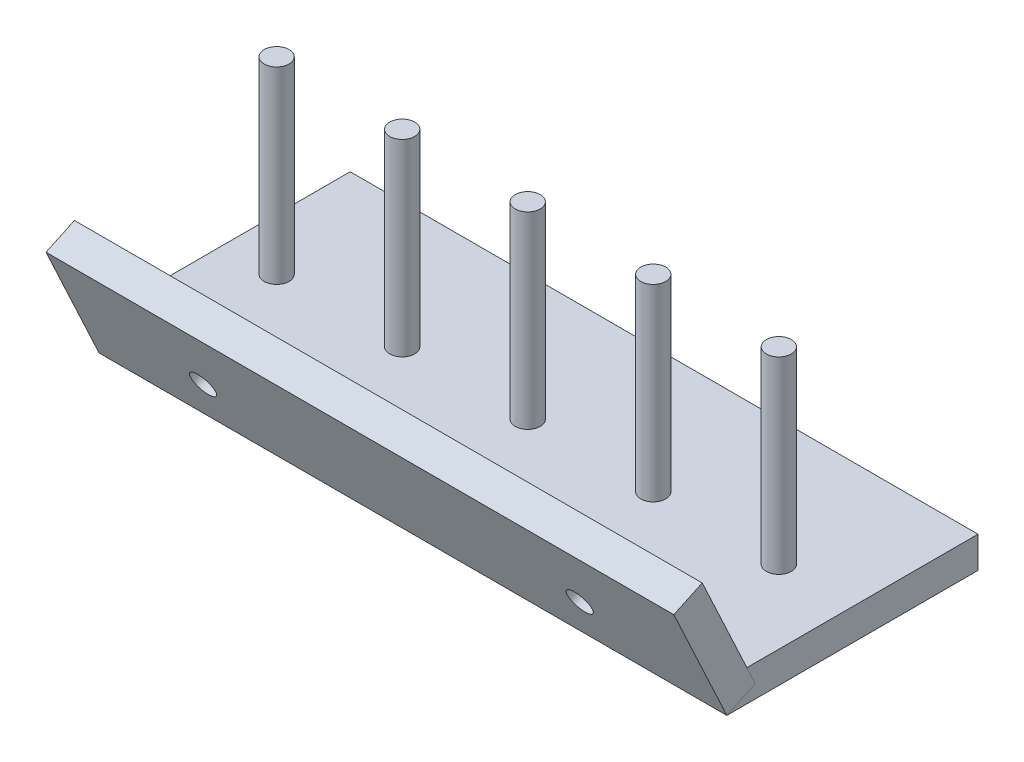
ISO-10303-21;
HEADER;
FILE_DESCRIPTION(('STEP AP214'),'2;1');
FILE_NAME('part.step','',(''),(''),'','','');
FILE_SCHEMA(('AUTOMOTIVE_DESIGN { 1 0 10303 214 1 1 1 1 }'));
ENDSEC;
DATA;
#1=APPLICATION_CONTEXT('core data for automotive mechanical design processes');
#2=APPLICATION_PROTOCOL_DEFINITION('international standard','automotive_design',2000,#1);
#3=PRODUCT_CONTEXT('',#1,'mechanical');
#4=PRODUCT('Part','Part','',(#3));
#5=PRODUCT_RELATED_PRODUCT_CATEGORY('part','',(#4));
#6=PRODUCT_DEFINITION_FORMATION('','',#4);
#7=PRODUCT_DEFINITION_CONTEXT('part definition',#1,'design');
#8=PRODUCT_DEFINITION('design','',#6,#7);
#9=PRODUCT_DEFINITION_SHAPE('','',#8);
#10=(LENGTH_UNIT() NAMED_UNIT(*) SI_UNIT(.MILLI.,.METRE.));
#11=(NAMED_UNIT(*) PLANE_ANGLE_UNIT() SI_UNIT($,.RADIAN.));
#12=(NAMED_UNIT(*) SI_UNIT($,.STERADIAN.) SOLID_ANGLE_UNIT());
#13=UNCERTAINTY_MEASURE_WITH_UNIT(LENGTH_MEASURE(1.E-05),#10,'distance_accuracy_value','');
#14=(GEOMETRIC_REPRESENTATION_CONTEXT(3) GLOBAL_UNCERTAINTY_ASSIGNED_CONTEXT((#13)) GLOBAL_UNIT_ASSIGNED_CONTEXT((#10,
#11,#12)) REPRESENTATION_CONTEXT('',''));
#15=CARTESIAN_POINT('',(0.,0.,0.));
#16=DIRECTION('',(0.,0.,1.));
#17=DIRECTION('',(1.,0.,0.));
#18=AXIS2_PLACEMENT_3D('',#15,#16,#17);
#19=CARTESIAN_POINT('',(30.,11.606943430307,14.3786274196991));
#20=DIRECTION('',(0.,-0.422618261740703,0.906307787036648));
#21=DIRECTION('',(0.,-0.906307787036648,-0.422618261740703));
#22=AXIS2_PLACEMENT_3D('',#19,#20,#21);
#23=CYLINDRICAL_SURFACE('',#22,2.00000000000001);
#24=CARTESIAN_POINT('',(30.,7.38076081289992,23.4417052900656));
#25=DIRECTION('',(0.,-0.422618261740703,0.906307787036648));
#26=DIRECTION('',(0.,-0.906307787036648,-0.422618261740703));
#27=AXIS2_PLACEMENT_3D('',#24,#25,#26);
#28=CIRCLE('',#27,2.00000000000001);
#29=CARTESIAN_POINT('',(30.,5.56814523882662,22.5964687665842));
#30=VERTEX_POINT('',#29);
#31=EDGE_CURVE('E133',#30,#30,#28,.T.);
#32=ORIENTED_EDGE('',*,*,#31,.T.);
#33=EDGE_LOOP('',(#32));
#34=FACE_BOUND('',#33,.T.);
#35=CARTESIAN_POINT('',(30.,8.64861559812204,20.7227819289556));
#36=DIRECTION('',(0.,0.422618261740703,-0.906307787036648));
#37=DIRECTION('',(0.,0.906307787036648,0.422618261740703));
#38=AXIS2_PLACEMENT_3D('',#35,#36,#37);
#39=CIRCLE('',#38,2.00000000000001);
#40=CARTESIAN_POINT('',(30.,10.4612311721953,21.5680184524371));
#41=VERTEX_POINT('',#40);
#42=EDGE_CURVE('E125',#41,#41,#39,.F.);
#43=ORIENTED_EDGE('',*,*,#42,.F.);
#44=EDGE_LOOP('',(#43));
#45=FACE_BOUND('',#44,.T.);
#46=ADVANCED_FACE('F43',(#34,#45),#23,.F.);
#47=CARTESIAN_POINT('',(-30.,11.606943430307,14.3786274196991));
#48=DIRECTION('',(0.,-0.422618261740703,0.906307787036648));
#49=DIRECTION('',(0.,-0.906307787036648,-0.422618261740703));
#50=AXIS2_PLACEMENT_3D('',#47,#48,#49);
#51=CYLINDRICAL_SURFACE('',#50,2.00000000000001);
#52=CARTESIAN_POINT('',(-30.,7.38076081289992,23.4417052900656));
#53=DIRECTION('',(0.,-0.422618261740703,0.906307787036648));
#54=DIRECTION('',(0.,-0.906307787036648,-0.422618261740703));
#55=AXIS2_PLACEMENT_3D('',#52,#53,#54);
#56=CIRCLE('',#55,2.00000000000001);
#57=CARTESIAN_POINT('',(-30.,5.56814523882662,22.5964687665842));
#58=VERTEX_POINT('',#57);
#59=EDGE_CURVE('E115',#58,#58,#56,.T.);
#60=ORIENTED_EDGE('',*,*,#59,.T.);
#61=EDGE_LOOP('',(#60));
#62=FACE_BOUND('',#61,.T.);
#63=CARTESIAN_POINT('',(-30.,8.64861559812204,20.7227819289556));
#64=DIRECTION('',(0.,0.422618261740703,-0.906307787036648));
#65=DIRECTION('',(0.,0.906307787036648,0.422618261740703));
#66=AXIS2_PLACEMENT_3D('',#63,#64,#65);
#67=CIRCLE('',#66,2.00000000000001);
#68=CARTESIAN_POINT('',(-30.,10.4612311721953,21.5680184524371));
#69=VERTEX_POINT('',#68);
#70=EDGE_CURVE('E122',#69,#69,#67,.F.);
#71=ORIENTED_EDGE('',*,*,#70,.F.);
#72=EDGE_LOOP('',(#71));
#73=FACE_BOUND('',#72,.T.);
#74=ADVANCED_FACE('F162',(#62,#73),#51,.F.);
#75=CARTESIAN_POINT('',(-50.,2.11309130870352,15.4684610648168));
#76=DIRECTION('',(-1.,0.,0.));
#77=DIRECTION('',(0.,0.,1.));
#78=AXIS2_PLACEMENT_3D('',#75,#76,#77);
#79=PLANE('',#78);
#80=DIRECTION('',(0.,-0.906307787036648,-0.422618261740703));
#81=VECTOR('',#80,1.);
#82=CARTESIAN_POINT('',(-50.,0.,20.));
#83=LINE('',#82,#81);
#84=CARTESIAN_POINT('',(-50.,18.126155740733,28.4523652348141));
#85=VERTEX_POINT('',#84);
#86=CARTESIAN_POINT('',(-50.,0.,20.));
#87=VERTEX_POINT('',#86);
#88=EDGE_CURVE('E111',#85,#87,#83,.T.);
#89=ORIENTED_EDGE('',*,*,#88,.F.);
#90=DIRECTION('',(0.,-0.422618261740703,0.906307787036648));
#91=VECTOR('',#90,1.);
#92=CARTESIAN_POINT('',(-50.,20.2392470494365,23.9208262996308));
#93=LINE('',#92,#91);
#94=CARTESIAN_POINT('',(-50.,20.2392470494365,23.9208262996308));
#95=VERTEX_POINT('',#94);
#96=EDGE_CURVE('E12',#95,#85,#93,.T.);
#97=ORIENTED_EDGE('',*,*,#96,.F.);
#98=DIRECTION('',(0.,-0.906307787036648,-0.422618261740703));
#99=VECTOR('',#98,1.);
#100=CARTESIAN_POINT('',(-50.,2.11309130870352,15.4684610648168));
#101=LINE('',#100,#99);
#102=CARTESIAN_POINT('',(-50.,2.11309130870352,15.4684610648168));
#103=VERTEX_POINT('',#102);
#104=EDGE_CURVE('E104',#95,#103,#101,.T.);
#105=ORIENTED_EDGE('',*,*,#104,.T.);
#106=DIRECTION('',(0.,-0.422618261740703,0.906307787036648));
#107=VECTOR('',#106,1.);
#108=CARTESIAN_POINT('',(-50.,2.11309130870352,15.4684610648168));
#109=LINE('',#108,#107);
#110=EDGE_CURVE('E87',#103,#87,#109,.T.);
#111=ORIENTED_EDGE('',*,*,#110,.T.);
#112=EDGE_LOOP('',(#89,#97,#105,#111));
#113=FACE_BOUND('',#112,.T.);
#114=ADVANCED_FACE('F45',(#113),#79,.T.);
#115=CARTESIAN_POINT('',(-50.,20.2392470494365,23.9208262996308));
#116=DIRECTION('',(0.,0.906307787036648,0.422618261740703));
#117=DIRECTION('',(0.,-0.422618261740703,0.906307787036648));
#118=AXIS2_PLACEMENT_3D('',#115,#116,#117);
#119=PLANE('',#118);
#120=DIRECTION('',(-1.,0.,0.));
#121=VECTOR('',#120,1.);
#122=CARTESIAN_POINT('',(-50.,18.126155740733,28.4523652348141));
#123=LINE('',#122,#121);
#124=CARTESIAN_POINT('',(50.,18.126155740733,28.4523652348141));
#125=VERTEX_POINT('',#124);
#126=EDGE_CURVE('E106',#125,#85,#123,.T.);
#127=ORIENTED_EDGE('',*,*,#126,.F.);
#128=DIRECTION('',(0.,-0.422618261740703,0.906307787036648));
#129=VECTOR('',#128,1.);
#130=CARTESIAN_POINT('',(50.,20.2392470494365,23.9208262996308));
#131=LINE('',#130,#129);
#132=CARTESIAN_POINT('',(50.,20.2392470494365,23.9208262996308));
#133=VERTEX_POINT('',#132);
#134=EDGE_CURVE('E53',#133,#125,#131,.T.);
#135=ORIENTED_EDGE('',*,*,#134,.F.);
#136=DIRECTION('',(-1.,0.,0.));
#137=VECTOR('',#136,1.);
#138=CARTESIAN_POINT('',(-50.,20.2392470494365,23.9208262996308));
#139=LINE('',#138,#137);
#140=EDGE_CURVE('E101',#133,#95,#139,.T.);
#141=ORIENTED_EDGE('',*,*,#140,.T.);
#142=ORIENTED_EDGE('',*,*,#96,.T.);
#143=EDGE_LOOP('',(#127,#135,#141,#142));
#144=FACE_BOUND('',#143,.T.);
#145=ADVANCED_FACE('F179',(#144),#119,.T.);
#146=CARTESIAN_POINT('',(50.,2.11309130870352,15.4684610648168));
#147=DIRECTION('',(1.,0.,0.));
#148=DIRECTION('',(0.,0.,-1.));
#149=AXIS2_PLACEMENT_3D('',#146,#147,#148);
#150=PLANE('',#149);
#151=DIRECTION('',(0.,0.906307787036648,0.422618261740703));
#152=VECTOR('',#151,1.);
#153=CARTESIAN_POINT('',(50.,0.,20.));
#154=LINE('',#153,#152);
#155=CARTESIAN_POINT('',(50.,0.,20.));
#156=VERTEX_POINT('',#155);
#157=EDGE_CURVE('E95',#156,#125,#154,.T.);
#158=ORIENTED_EDGE('',*,*,#157,.F.);
#159=DIRECTION('',(0.,-0.422618261740703,0.906307787036648));
#160=VECTOR('',#159,1.);
#161=CARTESIAN_POINT('',(50.,2.11309130870352,15.4684610648168));
#162=LINE('',#161,#160);
#163=CARTESIAN_POINT('',(50.,2.11309130870352,15.4684610648168));
#164=VERTEX_POINT('',#163);
#165=EDGE_CURVE('E90',#164,#156,#162,.T.);
#166=ORIENTED_EDGE('',*,*,#165,.F.);
#167=DIRECTION('',(0.,0.906307787036648,0.422618261740703));
#168=VECTOR('',#167,1.);
#169=CARTESIAN_POINT('',(50.,2.11309130870352,15.4684610648168));
#170=LINE('',#169,#168);
#171=EDGE_CURVE('E93',#164,#133,#170,.T.);
#172=ORIENTED_EDGE('',*,*,#171,.T.);
#173=ORIENTED_EDGE('',*,*,#134,.T.);
#174=EDGE_LOOP('',(#158,#166,#172,#173));
#175=FACE_BOUND('',#174,.T.);
#176=ADVANCED_FACE('F92',(#175),#150,.T.);
#177=CARTESIAN_POINT('',(-50.,2.11309130870352,15.4684610648168));
#178=DIRECTION('',(0.,-0.906307787036648,-0.422618261740703));
#179=DIRECTION('',(0.,0.422618261740703,-0.906307787036648));
#180=AXIS2_PLACEMENT_3D('',#177,#178,#179);
#181=PLANE('',#180);
#182=DIRECTION('',(1.,0.,0.));
#183=VECTOR('',#182,1.);
#184=CARTESIAN_POINT('',(-50.,0.,20.));
#185=LINE('',#184,#183);
#186=EDGE_CURVE('E114',#87,#156,#185,.T.);
#187=ORIENTED_EDGE('',*,*,#186,.F.);
#188=ORIENTED_EDGE('',*,*,#110,.F.);
#189=DIRECTION('',(1.,0.,0.));
#190=VECTOR('',#189,1.);
#191=CARTESIAN_POINT('',(-50.,2.11309130870352,15.4684610648168));
#192=LINE('',#191,#190);
#193=EDGE_CURVE('E100',#103,#164,#192,.T.);
#194=ORIENTED_EDGE('',*,*,#193,.T.);
#195=ORIENTED_EDGE('',*,*,#165,.T.);
#196=EDGE_LOOP('',(#187,#188,#194,#195));
#197=FACE_BOUND('',#196,.T.);
#198=ADVANCED_FACE('F103',(#197),#181,.T.);
#199=CARTESIAN_POINT('',(0.,-5.54735312248632,11.8963371616821));
#200=DIRECTION('',(0.,0.422618261740703,-0.906307787036648));
#201=DIRECTION('',(0.,0.906307787036648,0.422618261740703));
#202=AXIS2_PLACEMENT_3D('',#199,#200,#201);
#203=PLANE('',#202);
#204=CARTESIAN_POINT('',(30.,9.49385212160344,18.9101663548823));
#205=DIRECTION('',(0.,0.422618261740703,-0.906307787036648));
#206=DIRECTION('',(0.,0.906307787036648,0.422618261740703));
#207=AXIS2_PLACEMENT_3D('',#204,#205,#206);
#208=CIRCLE('',#207,2.99559975740138);
#209=CARTESIAN_POINT('',(30.,12.2087875085814,20.1761615172262));
#210=VERTEX_POINT('',#209);
#211=EDGE_CURVE('E47',#210,#210,#208,.F.);
#212=ORIENTED_EDGE('',*,*,#211,.T.);
#213=EDGE_LOOP('',(#212));
#214=FACE_BOUND('',#213,.T.);
#215=CARTESIAN_POINT('',(-30.,9.49385212160344,18.9101663548823));
#216=DIRECTION('',(0.,0.422618261740703,-0.906307787036648));
#217=DIRECTION('',(0.,0.906307787036648,0.422618261740703));
#218=AXIS2_PLACEMENT_3D('',#215,#216,#217);
#219=CIRCLE('',#218,3.);
#220=CARTESIAN_POINT('',(-30.,12.2127754827134,20.1780211401045));
#221=VERTEX_POINT('',#220);
#222=EDGE_CURVE('E128',#221,#221,#219,.F.);
#223=ORIENTED_EDGE('',*,*,#222,.T.);
#224=EDGE_LOOP('',(#223));
#225=FACE_BOUND('',#224,.T.);
#226=ORIENTED_EDGE('',*,*,#104,.F.);
#227=ORIENTED_EDGE('',*,*,#140,.F.);
#228=ORIENTED_EDGE('',*,*,#171,.F.);
#229=ORIENTED_EDGE('',*,*,#193,.F.);
#230=EDGE_LOOP('',(#226,#227,#228,#229));
#231=FACE_BOUND('',#230,.T.);
#232=ADVANCED_FACE('F99',(#214,#225,#231),#203,.T.);
#233=CARTESIAN_POINT('',(0.,-7.66044443118983,16.4278760968653));
#234=DIRECTION('',(0.,0.422618261740703,-0.906307787036648));
#235=DIRECTION('',(0.,0.906307787036648,0.422618261740703));
#236=AXIS2_PLACEMENT_3D('',#233,#234,#235);
#237=PLANE('',#236);
#238=ORIENTED_EDGE('',*,*,#59,.F.);
#239=EDGE_LOOP('',(#238));
#240=FACE_BOUND('',#239,.T.);
#241=ORIENTED_EDGE('',*,*,#31,.F.);
#242=EDGE_LOOP('',(#241));
#243=FACE_BOUND('',#242,.T.);
#244=ORIENTED_EDGE('',*,*,#88,.T.);
#245=ORIENTED_EDGE('',*,*,#186,.T.);
#246=ORIENTED_EDGE('',*,*,#157,.T.);
#247=ORIENTED_EDGE('',*,*,#126,.T.);
#248=EDGE_LOOP('',(#244,#245,#246,#247));
#249=FACE_BOUND('',#248,.T.);
#250=ADVANCED_FACE('F174',(#240,#243,#249),#237,.F.);
#251=CARTESIAN_POINT('',(-30.,8.64861559812203,20.7227819289556));
#252=DIRECTION('',(0.,0.422618261740703,-0.906307787036648));
#253=DIRECTION('',(0.,0.906307787036648,0.422618261740703));
#254=AXIS2_PLACEMENT_3D('',#251,#252,#253);
#255=PLANE('',#254);
#256=CARTESIAN_POINT('',(-30.,8.64861559812203,20.7227819289556));
#257=DIRECTION('',(0.,0.422618261740703,-0.906307787036648));
#258=DIRECTION('',(0.,0.906307787036648,0.422618261740703));
#259=AXIS2_PLACEMENT_3D('',#256,#257,#258);
#260=CIRCLE('',#259,3.);
#261=CARTESIAN_POINT('',(-30.,11.367538959232,21.9906367141778));
#262=VERTEX_POINT('',#261);
#263=EDGE_CURVE('E142',#262,#262,#260,.T.);
#264=ORIENTED_EDGE('',*,*,#263,.T.);
#265=EDGE_LOOP('',(#264));
#266=FACE_BOUND('',#265,.T.);
#267=ORIENTED_EDGE('',*,*,#70,.T.);
#268=EDGE_LOOP('',(#267));
#269=FACE_BOUND('',#268,.T.);
#270=ADVANCED_FACE('F177',(#266,#269),#255,.T.);
#271=CARTESIAN_POINT('',(-30.,28.9528665057653,-22.8198246582473));
#272=DIRECTION('',(0.,-0.422618261740703,0.906307787036648));
#273=DIRECTION('',(0.,-0.906307787036648,-0.422618261740704));
#274=AXIS2_PLACEMENT_3D('',#271,#272,#273);
#275=CYLINDRICAL_SURFACE('',#274,3.);
#276=ORIENTED_EDGE('',*,*,#222,.F.);
#277=EDGE_LOOP('',(#276));
#278=FACE_BOUND('',#277,.T.);
#279=ORIENTED_EDGE('',*,*,#263,.F.);
#280=EDGE_LOOP('',(#279));
#281=FACE_BOUND('',#280,.T.);
#282=ADVANCED_FACE('F158',(#278,#281),#275,.F.);
#283=CARTESIAN_POINT('',(30.,8.64861559812203,20.7227819289556));
#284=DIRECTION('',(0.,0.422618261740703,-0.906307787036648));
#285=DIRECTION('',(0.,0.906307787036648,0.422618261740703));
#286=AXIS2_PLACEMENT_3D('',#283,#284,#285);
#287=PLANE('',#286);
#288=CARTESIAN_POINT('',(30.,8.64861559812203,20.7227819289556));
#289=DIRECTION('',(0.,0.422618261740703,-0.906307787036648));
#290=DIRECTION('',(0.,0.906307787036648,0.422618261740703));
#291=AXIS2_PLACEMENT_3D('',#288,#289,#290);
#292=CIRCLE('',#291,2.99559975740138);
#293=CARTESIAN_POINT('',(30.,11.3635509851,21.9887770912995));
#294=VERTEX_POINT('',#293);
#295=EDGE_CURVE('E126',#294,#294,#292,.T.);
#296=ORIENTED_EDGE('',*,*,#295,.T.);
#297=EDGE_LOOP('',(#296));
#298=FACE_BOUND('',#297,.T.);
#299=ORIENTED_EDGE('',*,*,#42,.T.);
#300=EDGE_LOOP('',(#299));
#301=FACE_BOUND('',#300,.T.);
#302=ADVANCED_FACE('F148',(#298,#301),#287,.T.);
#303=CARTESIAN_POINT('',(30.,28.9528665057653,-22.8198246582473));
#304=DIRECTION('',(0.,-0.422618261740703,0.906307787036648));
#305=DIRECTION('',(0.,-0.906307787036648,-0.422618261740704));
#306=AXIS2_PLACEMENT_3D('',#303,#304,#305);
#307=CYLINDRICAL_SURFACE('',#306,2.99559975740138);
#308=ORIENTED_EDGE('',*,*,#211,.F.);
#309=EDGE_LOOP('',(#308));
#310=FACE_BOUND('',#309,.T.);
#311=ORIENTED_EDGE('',*,*,#295,.F.);
#312=EDGE_LOOP('',(#311));
#313=FACE_BOUND('',#312,.T.);
#314=ADVANCED_FACE('F151',(#310,#313),#307,.F.);
#315=CLOSED_SHELL('',(#46,#74,#114,#145,#176,#198,#232,#250,#270,#282,#302,#314));
#316=MANIFOLD_SOLID_BREP('B2',#315);
#317=CARTESIAN_POINT('',(-50.,5.,-20.));
#318=DIRECTION('',(1.,0.,0.));
#319=DIRECTION('',(0.,0.,-1.));
#320=AXIS2_PLACEMENT_3D('',#317,#318,#319);
#321=PLANE('',#320);
#322=DIRECTION('',(0.,0.,1.));
#323=VECTOR('',#322,1.);
#324=CARTESIAN_POINT('',(-50.,0.,-20.));
#325=LINE('',#324,#323);
#326=CARTESIAN_POINT('',(-50.,0.,-20.));
#327=VERTEX_POINT('',#326);
#328=CARTESIAN_POINT('',(-50.,0.,20.));
#329=VERTEX_POINT('',#328);
#330=EDGE_CURVE('E332',#327,#329,#325,.T.);
#331=ORIENTED_EDGE('',*,*,#330,.T.);
#332=DIRECTION('',(0.,-1.,0.));
#333=VECTOR('',#332,1.);
#334=CARTESIAN_POINT('',(-50.,5.,20.));
#335=LINE('',#334,#333);
#336=CARTESIAN_POINT('',(-50.,5.,20.));
#337=VERTEX_POINT('',#336);
#338=EDGE_CURVE('E41',#337,#329,#335,.T.);
#339=ORIENTED_EDGE('',*,*,#338,.F.);
#340=DIRECTION('',(0.,0.,1.));
#341=VECTOR('',#340,1.);
#342=CARTESIAN_POINT('',(-50.,5.,-20.));
#343=LINE('',#342,#341);
#344=CARTESIAN_POINT('',(-50.,5.,-20.));
#345=VERTEX_POINT('',#344);
#346=EDGE_CURVE('E320',#345,#337,#343,.T.);
#347=ORIENTED_EDGE('',*,*,#346,.F.);
#348=DIRECTION('',(0.,-1.,0.));
#349=VECTOR('',#348,1.);
#350=CARTESIAN_POINT('',(-50.,5.,-20.));
#351=LINE('',#350,#349);
#352=EDGE_CURVE('E328',#345,#327,#351,.T.);
#353=ORIENTED_EDGE('',*,*,#352,.T.);
#354=EDGE_LOOP('',(#331,#339,#347,#353));
#355=FACE_BOUND('',#354,.T.);
#356=ADVANCED_FACE('F269',(#355),#321,.F.);
#357=CARTESIAN_POINT('',(-50.,5.,20.));
#358=DIRECTION('',(0.,0.,-1.));
#359=DIRECTION('',(-1.,0.,0.));
#360=AXIS2_PLACEMENT_3D('',#357,#358,#359);
#361=PLANE('',#360);
#362=DIRECTION('',(1.,0.,0.));
#363=VECTOR('',#362,1.);
#364=CARTESIAN_POINT('',(-50.,0.,20.));
#365=LINE('',#364,#363);
#366=CARTESIAN_POINT('',(50.,0.,20.));
#367=VERTEX_POINT('',#366);
#368=EDGE_CURVE('E324',#329,#367,#365,.T.);
#369=ORIENTED_EDGE('',*,*,#368,.T.);
#370=DIRECTION('',(0.,-1.,0.));
#371=VECTOR('',#370,1.);
#372=CARTESIAN_POINT('',(50.,5.,20.));
#373=LINE('',#372,#371);
#374=CARTESIAN_POINT('',(50.,5.,20.));
#375=VERTEX_POINT('',#374);
#376=EDGE_CURVE('E277',#375,#367,#373,.T.);
#377=ORIENTED_EDGE('',*,*,#376,.F.);
#378=DIRECTION('',(1.,0.,0.));
#379=VECTOR('',#378,1.);
#380=CARTESIAN_POINT('',(-50.,5.,20.));
#381=LINE('',#380,#379);
#382=EDGE_CURVE('E315',#337,#375,#381,.T.);
#383=ORIENTED_EDGE('',*,*,#382,.F.);
#384=ORIENTED_EDGE('',*,*,#338,.T.);
#385=EDGE_LOOP('',(#369,#377,#383,#384));
#386=FACE_BOUND('',#385,.T.);
#387=ADVANCED_FACE('F323',(#386),#361,.F.);
#388=CARTESIAN_POINT('',(50.,5.,-20.));
#389=DIRECTION('',(-1.,0.,0.));
#390=DIRECTION('',(0.,0.,1.));
#391=AXIS2_PLACEMENT_3D('',#388,#389,#390);
#392=PLANE('',#391);
#393=DIRECTION('',(0.,0.,-1.));
#394=VECTOR('',#393,1.);
#395=CARTESIAN_POINT('',(50.,0.,-20.));
#396=LINE('',#395,#394);
#397=CARTESIAN_POINT('',(50.,0.,-20.));
#398=VERTEX_POINT('',#397);
#399=EDGE_CURVE('E302',#367,#398,#396,.T.);
#400=ORIENTED_EDGE('',*,*,#399,.T.);
#401=DIRECTION('',(0.,-1.,0.));
#402=VECTOR('',#401,1.);
#403=CARTESIAN_POINT('',(50.,5.,-20.));
#404=LINE('',#403,#402);
#405=CARTESIAN_POINT('',(50.,5.,-20.));
#406=VERTEX_POINT('',#405);
#407=EDGE_CURVE('E325',#406,#398,#404,.T.);
#408=ORIENTED_EDGE('',*,*,#407,.F.);
#409=DIRECTION('',(0.,0.,-1.));
#410=VECTOR('',#409,1.);
#411=CARTESIAN_POINT('',(50.,5.,-20.));
#412=LINE('',#411,#410);
#413=EDGE_CURVE('E318',#375,#406,#412,.T.);
#414=ORIENTED_EDGE('',*,*,#413,.F.);
#415=ORIENTED_EDGE('',*,*,#376,.T.);
#416=EDGE_LOOP('',(#400,#408,#414,#415));
#417=FACE_BOUND('',#416,.T.);
#418=ADVANCED_FACE('F326',(#417),#392,.F.);
#419=CARTESIAN_POINT('',(-50.,5.,-20.));
#420=DIRECTION('',(0.,0.,1.));
#421=DIRECTION('',(1.,0.,0.));
#422=AXIS2_PLACEMENT_3D('',#419,#420,#421);
#423=PLANE('',#422);
#424=DIRECTION('',(-1.,0.,0.));
#425=VECTOR('',#424,1.);
#426=CARTESIAN_POINT('',(-50.,0.,-20.));
#427=LINE('',#426,#425);
#428=EDGE_CURVE('E308',#398,#327,#427,.T.);
#429=ORIENTED_EDGE('',*,*,#428,.T.);
#430=ORIENTED_EDGE('',*,*,#352,.F.);
#431=DIRECTION('',(-1.,0.,0.));
#432=VECTOR('',#431,1.);
#433=CARTESIAN_POINT('',(-50.,5.,-20.));
#434=LINE('',#433,#432);
#435=EDGE_CURVE('E285',#406,#345,#434,.T.);
#436=ORIENTED_EDGE('',*,*,#435,.F.);
#437=ORIENTED_EDGE('',*,*,#407,.T.);
#438=EDGE_LOOP('',(#429,#430,#436,#437));
#439=FACE_BOUND('',#438,.T.);
#440=ADVANCED_FACE('F340',(#439),#423,.F.);
#441=CARTESIAN_POINT('',(0.,5.,0.));
#442=DIRECTION('',(0.,1.,0.));
#443=DIRECTION('',(0.,0.,1.));
#444=AXIS2_PLACEMENT_3D('',#441,#442,#443);
#445=PLANE('',#444);
#446=CARTESIAN_POINT('',(-41.7195266545195,5.,5.58637014214901E-13));
#447=DIRECTION('',(0.,1.,0.));
#448=DIRECTION('',(0.,0.,1.));
#449=AXIS2_PLACEMENT_3D('',#446,#447,#448);
#450=CIRCLE('',#449,1.98920873259567);
#451=CARTESIAN_POINT('',(-41.7195266545195,5.,1.98920873259623));
#452=VERTEX_POINT('',#451);
#453=EDGE_CURVE('E370',#452,#452,#450,.T.);
#454=ORIENTED_EDGE('',*,*,#453,.F.);
#455=EDGE_LOOP('',(#454));
#456=FACE_BOUND('',#455,.T.);
#457=CARTESIAN_POINT('',(-21.7195266545195,5.,4.18977760661176E-13));
#458=DIRECTION('',(0.,1.,0.));
#459=DIRECTION('',(0.,0.,1.));
#460=AXIS2_PLACEMENT_3D('',#457,#458,#459);
#461=CIRCLE('',#460,1.98920873259567);
#462=CARTESIAN_POINT('',(-21.7195266545195,5.,1.98920873259609));
#463=VERTEX_POINT('',#462);
#464=EDGE_CURVE('E364',#463,#463,#461,.T.);
#465=ORIENTED_EDGE('',*,*,#464,.F.);
#466=EDGE_LOOP('',(#465));
#467=FACE_BOUND('',#466,.T.);
#468=CARTESIAN_POINT('',(-1.71952665451954,5.,2.79318507107451E-13));
#469=DIRECTION('',(0.,1.,0.));
#470=DIRECTION('',(0.,0.,1.));
#471=AXIS2_PLACEMENT_3D('',#468,#469,#470);
#472=CIRCLE('',#471,1.98920873259567);
#473=CARTESIAN_POINT('',(-1.71952665451954,5.,1.98920873259595));
#474=VERTEX_POINT('',#473);
#475=EDGE_CURVE('E358',#474,#474,#472,.T.);
#476=ORIENTED_EDGE('',*,*,#475,.F.);
#477=EDGE_LOOP('',(#476));
#478=FACE_BOUND('',#477,.T.);
#479=CARTESIAN_POINT('',(18.2804733454805,5.,1.39659253553725E-13));
#480=DIRECTION('',(0.,1.,0.));
#481=DIRECTION('',(0.,0.,1.));
#482=AXIS2_PLACEMENT_3D('',#479,#480,#481);
#483=CIRCLE('',#482,1.98920873259567);
#484=CARTESIAN_POINT('',(18.2804733454805,5.,1.98920873259581));
#485=VERTEX_POINT('',#484);
#486=EDGE_CURVE('E352',#485,#485,#483,.T.);
#487=ORIENTED_EDGE('',*,*,#486,.F.);
#488=EDGE_LOOP('',(#487));
#489=FACE_BOUND('',#488,.T.);
#490=CARTESIAN_POINT('',(38.2804733454805,5.,0.));
#491=DIRECTION('',(0.,1.,0.));
#492=DIRECTION('',(0.,0.,1.));
#493=AXIS2_PLACEMENT_3D('',#490,#491,#492);
#494=CIRCLE('',#493,1.98920873259567);
#495=CARTESIAN_POINT('',(38.2804733454805,5.,1.98920873259567));
#496=VERTEX_POINT('',#495);
#497=EDGE_CURVE('E346',#496,#496,#494,.T.);
#498=ORIENTED_EDGE('',*,*,#497,.F.);
#499=EDGE_LOOP('',(#498));
#500=FACE_BOUND('',#499,.T.);
#501=ORIENTED_EDGE('',*,*,#346,.T.);
#502=ORIENTED_EDGE('',*,*,#382,.T.);
#503=ORIENTED_EDGE('',*,*,#413,.T.);
#504=ORIENTED_EDGE('',*,*,#435,.T.);
#505=EDGE_LOOP('',(#501,#502,#503,#504));
#506=FACE_BOUND('',#505,.T.);
#507=ADVANCED_FACE('F316',(#456,#467,#478,#489,#500,#506),#445,.T.);
#508=CARTESIAN_POINT('',(0.,0.,0.));
#509=DIRECTION('',(0.,1.,0.));
#510=DIRECTION('',(0.,0.,1.));
#511=AXIS2_PLACEMENT_3D('',#508,#509,#510);
#512=PLANE('',#511);
#513=ORIENTED_EDGE('',*,*,#330,.F.);
#514=ORIENTED_EDGE('',*,*,#428,.F.);
#515=ORIENTED_EDGE('',*,*,#399,.F.);
#516=ORIENTED_EDGE('',*,*,#368,.F.);
#517=EDGE_LOOP('',(#513,#514,#515,#516));
#518=FACE_BOUND('',#517,.T.);
#519=ADVANCED_FACE('F343',(#518),#512,.F.);
#520=CARTESIAN_POINT('',(38.2804733454805,35.,0.));
#521=DIRECTION('',(0.,-1.,0.));
#522=DIRECTION('',(0.,0.,-1.));
#523=AXIS2_PLACEMENT_3D('',#520,#521,#522);
#524=CYLINDRICAL_SURFACE('',#523,1.98920873259567);
#525=CARTESIAN_POINT('',(38.2804733454805,35.,0.));
#526=DIRECTION('',(0.,1.,0.));
#527=DIRECTION('',(0.,0.,1.));
#528=AXIS2_PLACEMENT_3D('',#525,#526,#527);
#529=CIRCLE('',#528,1.98920873259567);
#530=CARTESIAN_POINT('',(38.2804733454805,35.,1.98920873259567));
#531=VERTEX_POINT('',#530);
#532=EDGE_CURVE('E335',#531,#531,#529,.T.);
#533=ORIENTED_EDGE('',*,*,#532,.F.);
#534=EDGE_LOOP('',(#533));
#535=FACE_BOUND('',#534,.T.);
#536=ORIENTED_EDGE('',*,*,#497,.T.);
#537=EDGE_LOOP('',(#536));
#538=FACE_BOUND('',#537,.T.);
#539=ADVANCED_FACE('F396',(#535,#538),#524,.T.);
#540=CARTESIAN_POINT('',(38.2804733454805,35.,0.));
#541=DIRECTION('',(0.,1.,0.));
#542=DIRECTION('',(0.,0.,1.));
#543=AXIS2_PLACEMENT_3D('',#540,#541,#542);
#544=PLANE('',#543);
#545=ORIENTED_EDGE('',*,*,#532,.T.);
#546=EDGE_LOOP('',(#545));
#547=FACE_BOUND('',#546,.T.);
#548=ADVANCED_FACE('F398',(#547),#544,.T.);
#549=CARTESIAN_POINT('',(18.2804733454805,35.,1.39659253553725E-13));
#550=DIRECTION('',(0.,-1.,0.));
#551=DIRECTION('',(0.,0.,-1.));
#552=AXIS2_PLACEMENT_3D('',#549,#550,#551);
#553=CYLINDRICAL_SURFACE('',#552,1.98920873259567);
#554=CARTESIAN_POINT('',(18.2804733454805,35.,1.39659253553725E-13));
#555=DIRECTION('',(0.,1.,0.));
#556=DIRECTION('',(0.,0.,1.));
#557=AXIS2_PLACEMENT_3D('',#554,#555,#556);
#558=CIRCLE('',#557,1.98920873259567);
#559=CARTESIAN_POINT('',(18.2804733454805,35.,1.98920873259581));
#560=VERTEX_POINT('',#559);
#561=EDGE_CURVE('E349',#560,#560,#558,.T.);
#562=ORIENTED_EDGE('',*,*,#561,.F.);
#563=EDGE_LOOP('',(#562));
#564=FACE_BOUND('',#563,.T.);
#565=ORIENTED_EDGE('',*,*,#486,.T.);
#566=EDGE_LOOP('',(#565));
#567=FACE_BOUND('',#566,.T.);
#568=ADVANCED_FACE('F405',(#564,#567),#553,.T.);
#569=CARTESIAN_POINT('',(18.2804733454805,35.,1.39659253553725E-13));
#570=DIRECTION('',(0.,1.,0.));
#571=DIRECTION('',(0.,0.,1.));
#572=AXIS2_PLACEMENT_3D('',#569,#570,#571);
#573=PLANE('',#572);
#574=ORIENTED_EDGE('',*,*,#561,.T.);
#575=EDGE_LOOP('',(#574));
#576=FACE_BOUND('',#575,.T.);
#577=ADVANCED_FACE('F453',(#576),#573,.T.);
#578=CARTESIAN_POINT('',(-1.71952665451954,35.,2.79318507107451E-13));
#579=DIRECTION('',(0.,-1.,0.));
#580=DIRECTION('',(0.,0.,-1.));
#581=AXIS2_PLACEMENT_3D('',#578,#579,#580);
#582=CYLINDRICAL_SURFACE('',#581,1.98920873259567);
#583=CARTESIAN_POINT('',(-1.71952665451954,35.,2.79318507107451E-13));
#584=DIRECTION('',(0.,1.,0.));
#585=DIRECTION('',(0.,0.,1.));
#586=AXIS2_PLACEMENT_3D('',#583,#584,#585);
#587=CIRCLE('',#586,1.98920873259567);
#588=CARTESIAN_POINT('',(-1.71952665451954,35.,1.98920873259595));
#589=VERTEX_POINT('',#588);
#590=EDGE_CURVE('E355',#589,#589,#587,.T.);
#591=ORIENTED_EDGE('',*,*,#590,.F.);
#592=EDGE_LOOP('',(#591));
#593=FACE_BOUND('',#592,.T.);
#594=ORIENTED_EDGE('',*,*,#475,.T.);
#595=EDGE_LOOP('',(#594));
#596=FACE_BOUND('',#595,.T.);
#597=ADVANCED_FACE('F462',(#593,#596),#582,.T.);
#598=CARTESIAN_POINT('',(-1.71952665451954,35.,2.79318507107451E-13));
#599=DIRECTION('',(0.,1.,0.));
#600=DIRECTION('',(0.,0.,1.));
#601=AXIS2_PLACEMENT_3D('',#598,#599,#600);
#602=PLANE('',#601);
#603=ORIENTED_EDGE('',*,*,#590,.T.);
#604=EDGE_LOOP('',(#603));
#605=FACE_BOUND('',#604,.T.);
#606=ADVANCED_FACE('F471',(#605),#602,.T.);
#607=CARTESIAN_POINT('',(-21.7195266545195,35.,4.18977760661176E-13));
#608=DIRECTION('',(0.,-1.,0.));
#609=DIRECTION('',(0.,0.,-1.));
#610=AXIS2_PLACEMENT_3D('',#607,#608,#609);
#611=CYLINDRICAL_SURFACE('',#610,1.98920873259567);
#612=CARTESIAN_POINT('',(-21.7195266545195,35.,4.18977760661176E-13));
#613=DIRECTION('',(0.,1.,0.));
#614=DIRECTION('',(0.,0.,1.));
#615=AXIS2_PLACEMENT_3D('',#612,#613,#614);
#616=CIRCLE('',#615,1.98920873259567);
#617=CARTESIAN_POINT('',(-21.7195266545195,35.,1.98920873259609));
#618=VERTEX_POINT('',#617);
#619=EDGE_CURVE('E361',#618,#618,#616,.T.);
#620=ORIENTED_EDGE('',*,*,#619,.F.);
#621=EDGE_LOOP('',(#620));
#622=FACE_BOUND('',#621,.T.);
#623=ORIENTED_EDGE('',*,*,#464,.T.);
#624=EDGE_LOOP('',(#623));
#625=FACE_BOUND('',#624,.T.);
#626=ADVANCED_FACE('F480',(#622,#625),#611,.T.);
#627=CARTESIAN_POINT('',(-21.7195266545195,35.,4.18977760661176E-13));
#628=DIRECTION('',(0.,1.,0.));
#629=DIRECTION('',(0.,0.,1.));
#630=AXIS2_PLACEMENT_3D('',#627,#628,#629);
#631=PLANE('',#630);
#632=ORIENTED_EDGE('',*,*,#619,.T.);
#633=EDGE_LOOP('',(#632));
#634=FACE_BOUND('',#633,.T.);
#635=ADVANCED_FACE('F381',(#634),#631,.T.);
#636=CARTESIAN_POINT('',(-41.7195266545195,35.,5.58637014214901E-13));
#637=DIRECTION('',(0.,-1.,0.));
#638=DIRECTION('',(0.,0.,-1.));
#639=AXIS2_PLACEMENT_3D('',#636,#637,#638);
#640=CYLINDRICAL_SURFACE('',#639,1.98920873259567);
#641=CARTESIAN_POINT('',(-41.7195266545195,35.,5.58637014214901E-13));
#642=DIRECTION('',(0.,1.,0.));
#643=DIRECTION('',(0.,0.,1.));
#644=AXIS2_PLACEMENT_3D('',#641,#642,#643);
#645=CIRCLE('',#644,1.98920873259567);
#646=CARTESIAN_POINT('',(-41.7195266545195,35.,1.98920873259623));
#647=VERTEX_POINT('',#646);
#648=EDGE_CURVE('E367',#647,#647,#645,.T.);
#649=ORIENTED_EDGE('',*,*,#648,.F.);
#650=EDGE_LOOP('',(#649));
#651=FACE_BOUND('',#650,.T.);
#652=ORIENTED_EDGE('',*,*,#453,.T.);
#653=EDGE_LOOP('',(#652));
#654=FACE_BOUND('',#653,.T.);
#655=ADVANCED_FACE('F378',(#651,#654),#640,.T.);
#656=CARTESIAN_POINT('',(-41.7195266545195,35.,5.58637014214901E-13));
#657=DIRECTION('',(0.,1.,0.));
#658=DIRECTION('',(0.,0.,1.));
#659=AXIS2_PLACEMENT_3D('',#656,#657,#658);
#660=PLANE('',#659);
#661=ORIENTED_EDGE('',*,*,#648,.T.);
#662=EDGE_LOOP('',(#661));
#663=FACE_BOUND('',#662,.T.);
#664=ADVANCED_FACE('F376',(#663),#660,.T.);
#665=CLOSED_SHELL('',(#356,#387,#418,#440,#507,#519,#539,#548,#568,#577,#597,#606,#626,#635,
#655,#664));
#666=MANIFOLD_SOLID_BREP('B6',#665);
#667=ADVANCED_BREP_SHAPE_REPRESENTATION('',(#18,#316,#666),#14);
#668=SHAPE_DEFINITION_REPRESENTATION(#9,#667);
ENDSEC;
END-ISO-10303-21;
